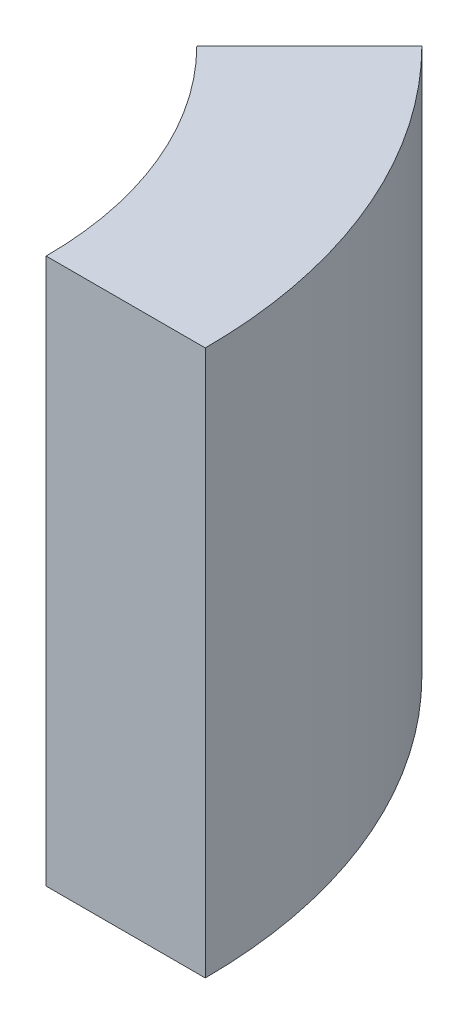
ISO-10303-21;
HEADER;
FILE_DESCRIPTION(('STEP AP214'),'2;1');
FILE_NAME('part.step','',(''),(''),'','','');
FILE_SCHEMA(('AUTOMOTIVE_DESIGN { 1 0 10303 214 1 1 1 1 }'));
ENDSEC;
DATA;
#1=APPLICATION_CONTEXT('core data for automotive mechanical design processes');
#2=APPLICATION_PROTOCOL_DEFINITION('international standard','automotive_design',2000,#1);
#3=PRODUCT_CONTEXT('',#1,'mechanical');
#4=PRODUCT('Part','Part','',(#3));
#5=PRODUCT_RELATED_PRODUCT_CATEGORY('part','',(#4));
#6=PRODUCT_DEFINITION_FORMATION('','',#4);
#7=PRODUCT_DEFINITION_CONTEXT('part definition',#1,'design');
#8=PRODUCT_DEFINITION('design','',#6,#7);
#9=PRODUCT_DEFINITION_SHAPE('','',#8);
#10=(LENGTH_UNIT() NAMED_UNIT(*) SI_UNIT(.MILLI.,.METRE.));
#11=(NAMED_UNIT(*) PLANE_ANGLE_UNIT() SI_UNIT($,.RADIAN.));
#12=(NAMED_UNIT(*) SI_UNIT($,.STERADIAN.) SOLID_ANGLE_UNIT());
#13=UNCERTAINTY_MEASURE_WITH_UNIT(LENGTH_MEASURE(1.E-05),#10,'distance_accuracy_value','');
#14=(GEOMETRIC_REPRESENTATION_CONTEXT(3) GLOBAL_UNCERTAINTY_ASSIGNED_CONTEXT((#13)) GLOBAL_UNIT_ASSIGNED_CONTEXT((#10,
#11,#12)) REPRESENTATION_CONTEXT('',''));
#15=CARTESIAN_POINT('',(0.,0.,0.));
#16=DIRECTION('',(0.,0.,1.));
#17=DIRECTION('',(1.,0.,0.));
#18=AXIS2_PLACEMENT_3D('',#15,#16,#17);
#19=CARTESIAN_POINT('',(0.,0.,0.));
#20=DIRECTION('',(0.,1.,0.));
#21=DIRECTION('',(0.,0.,1.));
#22=AXIS2_PLACEMENT_3D('',#19,#20,#21);
#23=PLANE('',#22);
#24=DIRECTION('',(-0.942641491092177,0.,0.333806859233775));
#25=VECTOR('',#24,1.);
#26=CARTESIAN_POINT('',(19.7954713129357,0.,-7.00994404390927));
#27=LINE('',#26,#25);
#28=CARTESIAN_POINT('',(19.7954713129357,0.,-7.00994404390927));
#29=VERTEX_POINT('',#28);
#30=CARTESIAN_POINT('',(15.0822638574748,0.,-5.3409097477404));
#31=VERTEX_POINT('',#30);
#32=EDGE_CURVE('E47',#29,#31,#27,.T.);
#33=ORIENTED_EDGE('',*,*,#32,.F.);
#34=CARTESIAN_POINT('',(0.,0.,0.));
#35=DIRECTION('',(0.,-1.,0.));
#36=DIRECTION('',(0.,0.,-1.));
#37=AXIS2_PLACEMENT_3D('',#34,#35,#36);
#38=CIRCLE('',#37,21.);
#39=CARTESIAN_POINT('',(18.9542909713471,0.,-9.04073303297415));
#40=VERTEX_POINT('',#39);
#41=EDGE_CURVE('E154',#40,#29,#38,.T.);
#42=ORIENTED_EDGE('',*,*,#41,.F.);
#43=DIRECTION('',(0.902585284349861,0.,-0.430511096808294));
#44=VECTOR('',#43,1.);
#45=CARTESIAN_POINT('',(14.4413645495978,0.,-6.88817754893269));
#46=LINE('',#45,#44);
#47=CARTESIAN_POINT('',(14.4413645495978,0.,-6.88817754893269));
#48=VERTEX_POINT('',#47);
#49=EDGE_CURVE('E153',#48,#40,#46,.T.);
#50=ORIENTED_EDGE('',*,*,#49,.F.);
#51=CARTESIAN_POINT('',(0.,0.,0.));
#52=DIRECTION('',(0.,-1.,0.));
#53=DIRECTION('',(0.,0.,1.));
#54=AXIS2_PLACEMENT_3D('',#51,#52,#53);
#55=CIRCLE('',#54,16.);
#56=CARTESIAN_POINT('',(11.3137084989847,0.,-11.3137084989848));
#57=VERTEX_POINT('',#56);
#58=EDGE_CURVE('E120',#57,#48,#55,.T.);
#59=ORIENTED_EDGE('',*,*,#58,.F.);
#60=DIRECTION('',(-0.707106781186546,0.,0.707106781186549));
#61=VECTOR('',#60,1.);
#62=CARTESIAN_POINT('',(11.3137084989847,0.,-11.3137084989848));
#63=LINE('',#62,#61);
#64=CARTESIAN_POINT('',(16.2634559672906,0.,-16.2634559672906));
#65=VERTEX_POINT('',#64);
#66=EDGE_CURVE('E124',#65,#57,#63,.T.);
#67=ORIENTED_EDGE('',*,*,#66,.F.);
#68=CARTESIAN_POINT('',(0.,0.,0.));
#69=DIRECTION('',(0.,1.,0.));
#70=DIRECTION('',(0.,0.,1.));
#71=AXIS2_PLACEMENT_3D('',#68,#69,#70);
#72=CIRCLE('',#71,23.);
#73=CARTESIAN_POINT('',(23.,0.,0.));
#74=VERTEX_POINT('',#73);
#75=EDGE_CURVE('E121',#74,#65,#72,.T.);
#76=ORIENTED_EDGE('',*,*,#75,.F.);
#77=DIRECTION('',(1.,0.,0.));
#78=VECTOR('',#77,1.);
#79=CARTESIAN_POINT('',(16.,0.,0.));
#80=LINE('',#79,#78);
#81=CARTESIAN_POINT('',(16.,0.,0.));
#82=VERTEX_POINT('',#81);
#83=EDGE_CURVE('E134',#82,#74,#80,.T.);
#84=ORIENTED_EDGE('',*,*,#83,.F.);
#85=EDGE_CURVE('E52',#31,#82,#55,.T.);
#86=ORIENTED_EDGE('',*,*,#85,.F.);
#87=EDGE_LOOP('',(#33,#42,#50,#59,#67,#76,#84,#86));
#88=FACE_BOUND('',#87,.T.);
#89=ADVANCED_FACE('F32',(#88),#23,.F.);
#90=CARTESIAN_POINT('',(0.,24.,0.));
#91=DIRECTION('',(0.,-1.,0.));
#92=DIRECTION('',(0.,0.,-1.));
#93=AXIS2_PLACEMENT_3D('',#90,#91,#92);
#94=CYLINDRICAL_SURFACE('',#93,23.);
#95=ORIENTED_EDGE('',*,*,#75,.T.);
#96=DIRECTION('',(0.,-1.,0.));
#97=VECTOR('',#96,1.);
#98=CARTESIAN_POINT('',(16.2634559672906,24.,-16.2634559672906));
#99=LINE('',#98,#97);
#100=CARTESIAN_POINT('',(16.2634559672906,24.,-16.2634559672906));
#101=VERTEX_POINT('',#100);
#102=EDGE_CURVE('E11',#101,#65,#99,.T.);
#103=ORIENTED_EDGE('',*,*,#102,.F.);
#104=CARTESIAN_POINT('',(0.,24.,0.));
#105=DIRECTION('',(0.,1.,0.));
#106=DIRECTION('',(0.,0.,1.));
#107=AXIS2_PLACEMENT_3D('',#104,#105,#106);
#108=CIRCLE('',#107,23.);
#109=CARTESIAN_POINT('',(23.,24.,0.));
#110=VERTEX_POINT('',#109);
#111=EDGE_CURVE('E130',#110,#101,#108,.T.);
#112=ORIENTED_EDGE('',*,*,#111,.F.);
#113=DIRECTION('',(0.,-1.,0.));
#114=VECTOR('',#113,1.);
#115=CARTESIAN_POINT('',(23.,24.,0.));
#116=LINE('',#115,#114);
#117=EDGE_CURVE('E139',#110,#74,#116,.T.);
#118=ORIENTED_EDGE('',*,*,#117,.T.);
#119=EDGE_LOOP('',(#95,#103,#112,#118));
#120=FACE_BOUND('',#119,.T.);
#121=ADVANCED_FACE('F34',(#120),#94,.T.);
#122=CARTESIAN_POINT('',(11.3137084989847,24.,-11.3137084989848));
#123=DIRECTION('',(0.707106781186549,0.,0.707106781186546));
#124=DIRECTION('',(0.707106781186546,0.,-0.707106781186549));
#125=AXIS2_PLACEMENT_3D('',#122,#123,#124);
#126=PLANE('',#125);
#127=ORIENTED_EDGE('',*,*,#66,.T.);
#128=DIRECTION('',(0.,-1.,0.));
#129=VECTOR('',#128,1.);
#130=CARTESIAN_POINT('',(11.3137084989847,24.,-11.3137084989848));
#131=LINE('',#130,#129);
#132=CARTESIAN_POINT('',(11.3137084989847,24.,-11.3137084989848));
#133=VERTEX_POINT('',#132);
#134=EDGE_CURVE('E40',#133,#57,#131,.T.);
#135=ORIENTED_EDGE('',*,*,#134,.F.);
#136=DIRECTION('',(-0.707106781186546,0.,0.707106781186549));
#137=VECTOR('',#136,1.);
#138=CARTESIAN_POINT('',(11.3137084989847,24.,-11.3137084989848));
#139=LINE('',#138,#137);
#140=EDGE_CURVE('E133',#101,#133,#139,.T.);
#141=ORIENTED_EDGE('',*,*,#140,.F.);
#142=ORIENTED_EDGE('',*,*,#102,.T.);
#143=EDGE_LOOP('',(#127,#135,#141,#142));
#144=FACE_BOUND('',#143,.T.);
#145=ADVANCED_FACE('F182',(#144),#126,.F.);
#146=CARTESIAN_POINT('',(0.,24.,0.));
#147=DIRECTION('',(0.,-1.,0.));
#148=DIRECTION('',(0.,0.,-1.));
#149=AXIS2_PLACEMENT_3D('',#146,#147,#148);
#150=CYLINDRICAL_SURFACE('',#149,16.);
#151=ORIENTED_EDGE('',*,*,#58,.T.);
#152=DIRECTION('',(0.,1.,0.));
#153=VECTOR('',#152,1.);
#154=CARTESIAN_POINT('',(14.4413645495978,-1.5,-6.88817754893269));
#155=LINE('',#154,#153);
#156=CARTESIAN_POINT('',(14.4413645495978,-1.5,-6.88817754893269));
#157=VERTEX_POINT('',#156);
#158=EDGE_CURVE('E100',#157,#48,#155,.T.);
#159=ORIENTED_EDGE('',*,*,#158,.F.);
#160=CARTESIAN_POINT('',(0.,-1.5,0.));
#161=DIRECTION('',(0.,1.,0.));
#162=DIRECTION('',(0.,0.,1.));
#163=AXIS2_PLACEMENT_3D('',#160,#161,#162);
#164=CIRCLE('',#163,16.);
#165=CARTESIAN_POINT('',(15.0822638574748,-1.5,-5.3409097477404));
#166=VERTEX_POINT('',#165);
#167=EDGE_CURVE('E106',#166,#157,#164,.T.);
#168=ORIENTED_EDGE('',*,*,#167,.F.);
#169=DIRECTION('',(0.,1.,0.));
#170=VECTOR('',#169,1.);
#171=CARTESIAN_POINT('',(15.0822638574748,-1.5,-5.3409097477404));
#172=LINE('',#171,#170);
#173=EDGE_CURVE('E161',#166,#31,#172,.T.);
#174=ORIENTED_EDGE('',*,*,#173,.T.);
#175=ORIENTED_EDGE('',*,*,#85,.T.);
#176=DIRECTION('',(0.,-1.,0.));
#177=VECTOR('',#176,1.);
#178=CARTESIAN_POINT('',(16.,24.,0.));
#179=LINE('',#178,#177);
#180=CARTESIAN_POINT('',(16.,24.,0.));
#181=VERTEX_POINT('',#180);
#182=EDGE_CURVE('E146',#181,#82,#179,.T.);
#183=ORIENTED_EDGE('',*,*,#182,.F.);
#184=CARTESIAN_POINT('',(0.,24.,0.));
#185=DIRECTION('',(0.,-1.,0.));
#186=DIRECTION('',(0.,0.,1.));
#187=AXIS2_PLACEMENT_3D('',#184,#185,#186);
#188=CIRCLE('',#187,16.);
#189=EDGE_CURVE('E136',#133,#181,#188,.T.);
#190=ORIENTED_EDGE('',*,*,#189,.F.);
#191=ORIENTED_EDGE('',*,*,#134,.T.);
#192=EDGE_LOOP('',(#151,#159,#168,#174,#175,#183,#190,#191));
#193=FACE_BOUND('',#192,.T.);
#194=ADVANCED_FACE('F117',(#193),#150,.F.);
#195=CARTESIAN_POINT('',(16.,24.,0.));
#196=DIRECTION('',(0.,0.,-1.));
#197=DIRECTION('',(-1.,0.,0.));
#198=AXIS2_PLACEMENT_3D('',#195,#196,#197);
#199=PLANE('',#198);
#200=ORIENTED_EDGE('',*,*,#83,.T.);
#201=ORIENTED_EDGE('',*,*,#117,.F.);
#202=DIRECTION('',(1.,0.,0.));
#203=VECTOR('',#202,1.);
#204=CARTESIAN_POINT('',(16.,24.,0.));
#205=LINE('',#204,#203);
#206=EDGE_CURVE('E138',#181,#110,#205,.T.);
#207=ORIENTED_EDGE('',*,*,#206,.F.);
#208=ORIENTED_EDGE('',*,*,#182,.T.);
#209=EDGE_LOOP('',(#200,#201,#207,#208));
#210=FACE_BOUND('',#209,.T.);
#211=ADVANCED_FACE('F186',(#210),#199,.F.);
#212=CARTESIAN_POINT('',(0.,24.,0.));
#213=DIRECTION('',(0.,1.,0.));
#214=DIRECTION('',(0.,0.,1.));
#215=AXIS2_PLACEMENT_3D('',#212,#213,#214);
#216=PLANE('',#215);
#217=ORIENTED_EDGE('',*,*,#111,.T.);
#218=ORIENTED_EDGE('',*,*,#140,.T.);
#219=ORIENTED_EDGE('',*,*,#189,.T.);
#220=ORIENTED_EDGE('',*,*,#206,.T.);
#221=EDGE_LOOP('',(#217,#218,#219,#220));
#222=FACE_BOUND('',#221,.T.);
#223=ADVANCED_FACE('F175',(#222),#216,.T.);
#224=CARTESIAN_POINT('',(14.4413645495978,-1.5,-6.88817754893269));
#225=DIRECTION('',(0.430511096808294,0.,0.902585284349861));
#226=DIRECTION('',(0.902585284349861,0.,-0.430511096808294));
#227=AXIS2_PLACEMENT_3D('',#224,#225,#226);
#228=PLANE('',#227);
#229=ORIENTED_EDGE('',*,*,#49,.T.);
#230=DIRECTION('',(0.,1.,0.));
#231=VECTOR('',#230,1.);
#232=CARTESIAN_POINT('',(18.9542909713471,-1.5,-9.04073303297415));
#233=LINE('',#232,#231);
#234=CARTESIAN_POINT('',(18.9542909713471,-1.5,-9.04073303297415));
#235=VERTEX_POINT('',#234);
#236=EDGE_CURVE('E102',#235,#40,#233,.T.);
#237=ORIENTED_EDGE('',*,*,#236,.F.);
#238=DIRECTION('',(0.902585284349861,0.,-0.430511096808294));
#239=VECTOR('',#238,1.);
#240=CARTESIAN_POINT('',(14.4413645495978,-1.5,-6.88817754893269));
#241=LINE('',#240,#239);
#242=EDGE_CURVE('E95',#157,#235,#241,.T.);
#243=ORIENTED_EDGE('',*,*,#242,.F.);
#244=ORIENTED_EDGE('',*,*,#158,.T.);
#245=EDGE_LOOP('',(#229,#237,#243,#244));
#246=FACE_BOUND('',#245,.T.);
#247=ADVANCED_FACE('F98',(#246),#228,.F.);
#248=CARTESIAN_POINT('',(0.,-1.5,0.));
#249=DIRECTION('',(0.,1.,0.));
#250=DIRECTION('',(0.,0.,1.));
#251=AXIS2_PLACEMENT_3D('',#248,#249,#250);
#252=CYLINDRICAL_SURFACE('',#251,21.);
#253=ORIENTED_EDGE('',*,*,#41,.T.);
#254=DIRECTION('',(0.,1.,0.));
#255=VECTOR('',#254,1.);
#256=CARTESIAN_POINT('',(19.7954713129357,-1.5,-7.00994404390927));
#257=LINE('',#256,#255);
#258=CARTESIAN_POINT('',(19.7954713129357,-1.5,-7.00994404390927));
#259=VERTEX_POINT('',#258);
#260=EDGE_CURVE('E126',#259,#29,#257,.T.);
#261=ORIENTED_EDGE('',*,*,#260,.F.);
#262=CARTESIAN_POINT('',(0.,-1.5,0.));
#263=DIRECTION('',(0.,-1.,0.));
#264=DIRECTION('',(0.,0.,-1.));
#265=AXIS2_PLACEMENT_3D('',#262,#263,#264);
#266=CIRCLE('',#265,21.);
#267=EDGE_CURVE('E105',#235,#259,#266,.T.);
#268=ORIENTED_EDGE('',*,*,#267,.F.);
#269=ORIENTED_EDGE('',*,*,#236,.T.);
#270=EDGE_LOOP('',(#253,#261,#268,#269));
#271=FACE_BOUND('',#270,.T.);
#272=ADVANCED_FACE('F167',(#271),#252,.T.);
#273=CARTESIAN_POINT('',(19.7954713129357,-1.5,-7.00994404390927));
#274=DIRECTION('',(-0.333806859233775,0.,-0.942641491092177));
#275=DIRECTION('',(-0.942641491092177,0.,0.333806859233775));
#276=AXIS2_PLACEMENT_3D('',#273,#274,#275);
#277=PLANE('',#276);
#278=ORIENTED_EDGE('',*,*,#32,.T.);
#279=ORIENTED_EDGE('',*,*,#173,.F.);
#280=DIRECTION('',(-0.942641491092177,0.,0.333806859233775));
#281=VECTOR('',#280,1.);
#282=CARTESIAN_POINT('',(19.7954713129357,-1.5,-7.00994404390927));
#283=LINE('',#282,#281);
#284=EDGE_CURVE('E111',#259,#166,#283,.T.);
#285=ORIENTED_EDGE('',*,*,#284,.F.);
#286=ORIENTED_EDGE('',*,*,#260,.T.);
#287=EDGE_LOOP('',(#278,#279,#285,#286));
#288=FACE_BOUND('',#287,.T.);
#289=ADVANCED_FACE('F165',(#288),#277,.F.);
#290=CARTESIAN_POINT('',(0.,-1.5,0.));
#291=DIRECTION('',(0.,1.,0.));
#292=DIRECTION('',(0.,0.,1.));
#293=AXIS2_PLACEMENT_3D('',#290,#291,#292);
#294=PLANE('',#293);
#295=ORIENTED_EDGE('',*,*,#167,.T.);
#296=ORIENTED_EDGE('',*,*,#242,.T.);
#297=ORIENTED_EDGE('',*,*,#267,.T.);
#298=ORIENTED_EDGE('',*,*,#284,.T.);
#299=EDGE_LOOP('',(#295,#296,#297,#298));
#300=FACE_BOUND('',#299,.T.);
#301=ADVANCED_FACE('F109',(#300),#294,.F.);
#302=CLOSED_SHELL('',(#89,#121,#145,#194,#211,#223,#247,#272,#289,#301));
#303=MANIFOLD_SOLID_BREP('B2',#302);
#304=ADVANCED_BREP_SHAPE_REPRESENTATION('',(#18,#303),#14);
#305=SHAPE_DEFINITION_REPRESENTATION(#9,#304);
ENDSEC;
END-ISO-10303-21;
